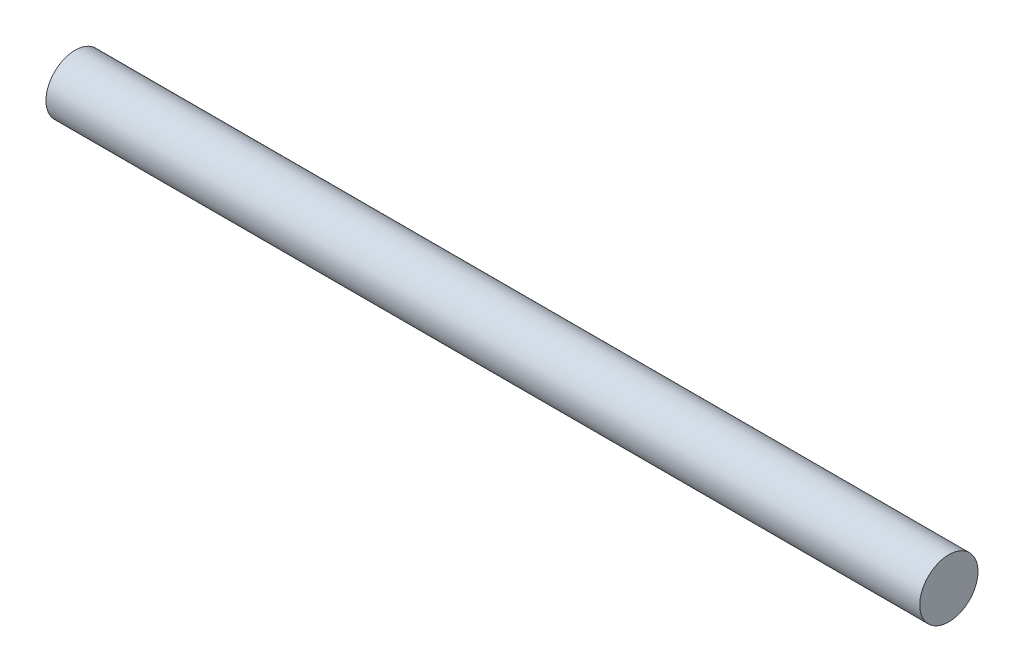
ISO-10303-21;
HEADER;
FILE_DESCRIPTION(('STEP AP214'),'2;1');
FILE_NAME('part.step','',(''),(''),'','','');
FILE_SCHEMA(('AUTOMOTIVE_DESIGN { 1 0 10303 214 1 1 1 1 }'));
ENDSEC;
DATA;
#1=APPLICATION_CONTEXT('core data for automotive mechanical design processes');
#2=APPLICATION_PROTOCOL_DEFINITION('international standard','automotive_design',2000,#1);
#3=PRODUCT_CONTEXT('',#1,'mechanical');
#4=PRODUCT('Part','Part','',(#3));
#5=PRODUCT_RELATED_PRODUCT_CATEGORY('part','',(#4));
#6=PRODUCT_DEFINITION_FORMATION('','',#4);
#7=PRODUCT_DEFINITION_CONTEXT('part definition',#1,'design');
#8=PRODUCT_DEFINITION('design','',#6,#7);
#9=PRODUCT_DEFINITION_SHAPE('','',#8);
#10=(LENGTH_UNIT() NAMED_UNIT(*) SI_UNIT(.MILLI.,.METRE.));
#11=(NAMED_UNIT(*) PLANE_ANGLE_UNIT() SI_UNIT($,.RADIAN.));
#12=(NAMED_UNIT(*) SI_UNIT($,.STERADIAN.) SOLID_ANGLE_UNIT());
#13=UNCERTAINTY_MEASURE_WITH_UNIT(LENGTH_MEASURE(1.E-05),#10,'distance_accuracy_value','');
#14=(GEOMETRIC_REPRESENTATION_CONTEXT(3) GLOBAL_UNCERTAINTY_ASSIGNED_CONTEXT((#13)) GLOBAL_UNIT_ASSIGNED_CONTEXT((#10,
#11,#12)) REPRESENTATION_CONTEXT('',''));
#15=CARTESIAN_POINT('',(0.,0.,0.));
#16=DIRECTION('',(0.,0.,1.));
#17=DIRECTION('',(1.,0.,0.));
#18=AXIS2_PLACEMENT_3D('',#15,#16,#17);
#19=CARTESIAN_POINT('',(150.,0.,0.));
#20=DIRECTION('',(-1.,0.,0.));
#21=DIRECTION('',(0.,0.,1.));
#22=AXIS2_PLACEMENT_3D('',#19,#20,#21);
#23=CYLINDRICAL_SURFACE('',#22,5.);
#24=CARTESIAN_POINT('',(150.,0.,0.));
#25=DIRECTION('',(1.,0.,0.));
#26=DIRECTION('',(0.,0.,-1.));
#27=AXIS2_PLACEMENT_3D('',#24,#25,#26);
#28=CIRCLE('',#27,5.);
#29=CARTESIAN_POINT('',(150.,0.,-5.));
#30=VERTEX_POINT('',#29);
#31=EDGE_CURVE('E10',#30,#30,#28,.T.);
#32=ORIENTED_EDGE('',*,*,#31,.F.);
#33=EDGE_LOOP('',(#32));
#34=FACE_BOUND('',#33,.T.);
#35=CARTESIAN_POINT('',(0.,0.,0.));
#36=DIRECTION('',(1.,0.,0.));
#37=DIRECTION('',(0.,0.,-1.));
#38=AXIS2_PLACEMENT_3D('',#35,#36,#37);
#39=CIRCLE('',#38,5.);
#40=CARTESIAN_POINT('',(0.,0.,-5.));
#41=VERTEX_POINT('',#40);
#42=EDGE_CURVE('E33',#41,#41,#39,.T.);
#43=ORIENTED_EDGE('',*,*,#42,.T.);
#44=EDGE_LOOP('',(#43));
#45=FACE_BOUND('',#44,.T.);
#46=ADVANCED_FACE('F30',(#34,#45),#23,.T.);
#47=CARTESIAN_POINT('',(150.,0.,0.));
#48=DIRECTION('',(1.,0.,0.));
#49=DIRECTION('',(0.,0.,-1.));
#50=AXIS2_PLACEMENT_3D('',#47,#48,#49);
#51=PLANE('',#50);
#52=ORIENTED_EDGE('',*,*,#31,.T.);
#53=EDGE_LOOP('',(#52));
#54=FACE_BOUND('',#53,.T.);
#55=ADVANCED_FACE('F45',(#54),#51,.T.);
#56=CARTESIAN_POINT('',(0.,0.,0.));
#57=DIRECTION('',(1.,0.,0.));
#58=DIRECTION('',(0.,0.,-1.));
#59=AXIS2_PLACEMENT_3D('',#56,#57,#58);
#60=PLANE('',#59);
#61=ORIENTED_EDGE('',*,*,#42,.F.);
#62=EDGE_LOOP('',(#61));
#63=FACE_BOUND('',#62,.T.);
#64=ADVANCED_FACE('F43',(#63),#60,.F.);
#65=CLOSED_SHELL('',(#46,#55,#64));
#66=MANIFOLD_SOLID_BREP('B2',#65);
#67=ADVANCED_BREP_SHAPE_REPRESENTATION('',(#18,#66),#14);
#68=SHAPE_DEFINITION_REPRESENTATION(#9,#67);
ENDSEC;
END-ISO-10303-21;
